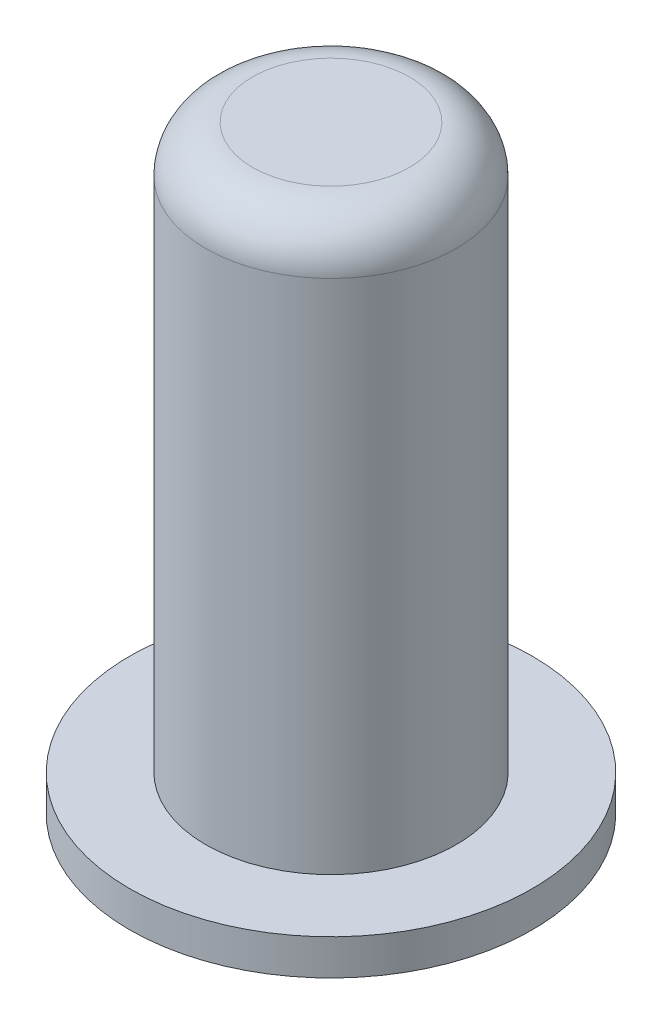
ISO-10303-21;
HEADER;
FILE_DESCRIPTION(('STEP AP214'),'2;1');
FILE_NAME('part.step','',(''),(''),'','','');
FILE_SCHEMA(('AUTOMOTIVE_DESIGN { 1 0 10303 214 1 1 1 1 }'));
ENDSEC;
DATA;
#1=APPLICATION_CONTEXT('core data for automotive mechanical design processes');
#2=APPLICATION_PROTOCOL_DEFINITION('international standard','automotive_design',2000,#1);
#3=PRODUCT_CONTEXT('',#1,'mechanical');
#4=PRODUCT('Part','Part','',(#3));
#5=PRODUCT_RELATED_PRODUCT_CATEGORY('part','',(#4));
#6=PRODUCT_DEFINITION_FORMATION('','',#4);
#7=PRODUCT_DEFINITION_CONTEXT('part definition',#1,'design');
#8=PRODUCT_DEFINITION('design','',#6,#7);
#9=PRODUCT_DEFINITION_SHAPE('','',#8);
#10=(LENGTH_UNIT() NAMED_UNIT(*) SI_UNIT(.MILLI.,.METRE.));
#11=(NAMED_UNIT(*) PLANE_ANGLE_UNIT() SI_UNIT($,.RADIAN.));
#12=(NAMED_UNIT(*) SI_UNIT($,.STERADIAN.) SOLID_ANGLE_UNIT());
#13=UNCERTAINTY_MEASURE_WITH_UNIT(LENGTH_MEASURE(1.E-05),#10,'distance_accuracy_value','');
#14=(GEOMETRIC_REPRESENTATION_CONTEXT(3) GLOBAL_UNCERTAINTY_ASSIGNED_CONTEXT((#13)) GLOBAL_UNIT_ASSIGNED_CONTEXT((#10,
#11,#12)) REPRESENTATION_CONTEXT('',''));
#15=CARTESIAN_POINT('',(0.,0.,0.));
#16=DIRECTION('',(0.,0.,1.));
#17=DIRECTION('',(1.,0.,0.));
#18=AXIS2_PLACEMENT_3D('',#15,#16,#17);
#19=CARTESIAN_POINT('',(0.,24.4348,0.));
#20=DIRECTION('',(0.,-1.,0.));
#21=DIRECTION('',(0.,0.,-1.));
#22=AXIS2_PLACEMENT_3D('',#19,#20,#21);
#23=CYLINDRICAL_SURFACE('',#22,5.4356);
#24=CARTESIAN_POINT('',(0.,22.4028,0.));
#25=DIRECTION('',(0.,1.,0.));
#26=DIRECTION('',(0.,0.,1.));
#27=AXIS2_PLACEMENT_3D('',#24,#25,#26);
#28=CIRCLE('',#27,5.4356);
#29=CARTESIAN_POINT('',(0.,22.4028,5.4356));
#30=VERTEX_POINT('',#29);
#31=EDGE_CURVE('E10',#30,#30,#28,.F.);
#32=ORIENTED_EDGE('',*,*,#31,.T.);
#33=EDGE_LOOP('',(#32));
#34=FACE_BOUND('',#33,.T.);
#35=CARTESIAN_POINT('',(0.,0.,0.));
#36=DIRECTION('',(0.,-1.,0.));
#37=DIRECTION('',(0.,0.,-1.));
#38=AXIS2_PLACEMENT_3D('',#35,#36,#37);
#39=CIRCLE('',#38,5.4356);
#40=CARTESIAN_POINT('',(0.,0.,-5.4356));
#41=VERTEX_POINT('',#40);
#42=EDGE_CURVE('E42',#41,#41,#39,.T.);
#43=ORIENTED_EDGE('',*,*,#42,.F.);
#44=EDGE_LOOP('',(#43));
#45=FACE_BOUND('',#44,.T.);
#46=ADVANCED_FACE('F31',(#34,#45),#23,.T.);
#47=CARTESIAN_POINT('',(0.,24.4348,0.));
#48=DIRECTION('',(0.,1.,0.));
#49=DIRECTION('',(0.,0.,1.));
#50=AXIS2_PLACEMENT_3D('',#47,#48,#49);
#51=PLANE('',#50);
#52=CARTESIAN_POINT('',(0.,24.4348,0.));
#53=DIRECTION('',(0.,1.,0.));
#54=DIRECTION('',(0.,0.,1.));
#55=AXIS2_PLACEMENT_3D('',#52,#53,#54);
#56=CIRCLE('',#55,3.4036);
#57=CARTESIAN_POINT('',(0.,24.4348,3.4036));
#58=VERTEX_POINT('',#57);
#59=EDGE_CURVE('E38',#58,#58,#56,.T.);
#60=ORIENTED_EDGE('',*,*,#59,.T.);
#61=EDGE_LOOP('',(#60));
#62=FACE_BOUND('',#61,.T.);
#63=ADVANCED_FACE('F66',(#62),#51,.T.);
#64=CARTESIAN_POINT('',(0.,0.,0.));
#65=DIRECTION('',(0.,-1.,0.));
#66=DIRECTION('',(0.,0.,-1.));
#67=AXIS2_PLACEMENT_3D('',#64,#65,#66);
#68=PLANE('',#67);
#69=CARTESIAN_POINT('',(0.,0.,0.));
#70=DIRECTION('',(0.,-1.,0.));
#71=DIRECTION('',(0.,0.,-1.));
#72=AXIS2_PLACEMENT_3D('',#69,#70,#71);
#73=CIRCLE('',#72,8.7376);
#74=CARTESIAN_POINT('',(0.,0.,-8.7376));
#75=VERTEX_POINT('',#74);
#76=EDGE_CURVE('E49',#75,#75,#73,.T.);
#77=ORIENTED_EDGE('',*,*,#76,.F.);
#78=EDGE_LOOP('',(#77));
#79=FACE_BOUND('',#78,.T.);
#80=ORIENTED_EDGE('',*,*,#42,.T.);
#81=EDGE_LOOP('',(#80));
#82=FACE_BOUND('',#81,.T.);
#83=ADVANCED_FACE('F60',(#79,#82),#68,.F.);
#84=CARTESIAN_POINT('',(0.,-1.5494,0.));
#85=DIRECTION('',(0.,1.,0.));
#86=DIRECTION('',(0.,0.,1.));
#87=AXIS2_PLACEMENT_3D('',#84,#85,#86);
#88=CYLINDRICAL_SURFACE('',#87,8.7376);
#89=CARTESIAN_POINT('',(0.,-1.5494,0.));
#90=DIRECTION('',(0.,-1.,0.));
#91=DIRECTION('',(0.,0.,-1.));
#92=AXIS2_PLACEMENT_3D('',#89,#90,#91);
#93=CIRCLE('',#92,8.7376);
#94=CARTESIAN_POINT('',(0.,-1.5494,-8.7376));
#95=VERTEX_POINT('',#94);
#96=EDGE_CURVE('E46',#95,#95,#93,.T.);
#97=ORIENTED_EDGE('',*,*,#96,.F.);
#98=EDGE_LOOP('',(#97));
#99=FACE_BOUND('',#98,.T.);
#100=ORIENTED_EDGE('',*,*,#76,.T.);
#101=EDGE_LOOP('',(#100));
#102=FACE_BOUND('',#101,.T.);
#103=ADVANCED_FACE('F57',(#99,#102),#88,.T.);
#104=CARTESIAN_POINT('',(0.,-1.5494,0.));
#105=DIRECTION('',(0.,-1.,0.));
#106=DIRECTION('',(0.,0.,-1.));
#107=AXIS2_PLACEMENT_3D('',#104,#105,#106);
#108=PLANE('',#107);
#109=ORIENTED_EDGE('',*,*,#96,.T.);
#110=EDGE_LOOP('',(#109));
#111=FACE_BOUND('',#110,.T.);
#112=ADVANCED_FACE('F55',(#111),#108,.T.);
#113=CARTESIAN_POINT('',(0.,22.4028,0.));
#114=DIRECTION('',(0.,1.,0.));
#115=DIRECTION('',(0.,0.,1.));
#116=AXIS2_PLACEMENT_3D('',#113,#114,#115);
#117=TOROIDAL_SURFACE('',#116,3.4036,2.032);
#118=ORIENTED_EDGE('',*,*,#31,.F.);
#119=EDGE_LOOP('',(#118));
#120=FACE_BOUND('',#119,.T.);
#121=ORIENTED_EDGE('',*,*,#59,.F.);
#122=EDGE_LOOP('',(#121));
#123=FACE_BOUND('',#122,.T.);
#124=ADVANCED_FACE('F33',(#120,#123),#117,.T.);
#125=CLOSED_SHELL('',(#46,#63,#83,#103,#112,#124));
#126=MANIFOLD_SOLID_BREP('B2',#125);
#127=ADVANCED_BREP_SHAPE_REPRESENTATION('',(#18,#126),#14);
#128=SHAPE_DEFINITION_REPRESENTATION(#9,#127);
ENDSEC;
END-ISO-10303-21;
